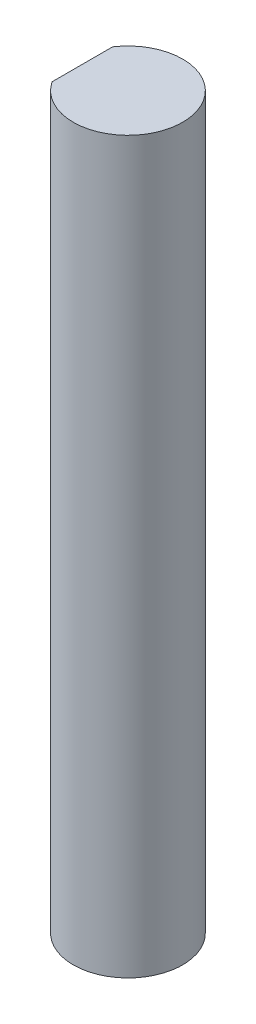
ISO-10303-21;
HEADER;
FILE_DESCRIPTION(('STEP AP214'),'2;1');
FILE_NAME('part.step','',(''),(''),'','','');
FILE_SCHEMA(('AUTOMOTIVE_DESIGN { 1 0 10303 214 1 1 1 1 }'));
ENDSEC;
DATA;
#1=APPLICATION_CONTEXT('core data for automotive mechanical design processes');
#2=APPLICATION_PROTOCOL_DEFINITION('international standard','automotive_design',2000,#1);
#3=PRODUCT_CONTEXT('',#1,'mechanical');
#4=PRODUCT('Part','Part','',(#3));
#5=PRODUCT_RELATED_PRODUCT_CATEGORY('part','',(#4));
#6=PRODUCT_DEFINITION_FORMATION('','',#4);
#7=PRODUCT_DEFINITION_CONTEXT('part definition',#1,'design');
#8=PRODUCT_DEFINITION('design','',#6,#7);
#9=PRODUCT_DEFINITION_SHAPE('','',#8);
#10=(LENGTH_UNIT() NAMED_UNIT(*) SI_UNIT(.MILLI.,.METRE.));
#11=(NAMED_UNIT(*) PLANE_ANGLE_UNIT() SI_UNIT($,.RADIAN.));
#12=(NAMED_UNIT(*) SI_UNIT($,.STERADIAN.) SOLID_ANGLE_UNIT());
#13=UNCERTAINTY_MEASURE_WITH_UNIT(LENGTH_MEASURE(1.E-05),#10,'distance_accuracy_value','');
#14=(GEOMETRIC_REPRESENTATION_CONTEXT(3) GLOBAL_UNCERTAINTY_ASSIGNED_CONTEXT((#13)) GLOBAL_UNIT_ASSIGNED_CONTEXT((#10,
#11,#12)) REPRESENTATION_CONTEXT('',''));
#15=CARTESIAN_POINT('',(0.,0.,0.));
#16=DIRECTION('',(0.,0.,1.));
#17=DIRECTION('',(1.,0.,0.));
#18=AXIS2_PLACEMENT_3D('',#15,#16,#17);
#19=CARTESIAN_POINT('',(0.,40.,0.));
#20=DIRECTION('',(0.,-1.,0.));
#21=DIRECTION('',(0.,0.,-1.));
#22=AXIS2_PLACEMENT_3D('',#19,#20,#21);
#23=CYLINDRICAL_SURFACE('',#22,3.);
#24=CARTESIAN_POINT('',(0.,0.,0.));
#25=DIRECTION('',(0.,1.,0.));
#26=DIRECTION('',(0.,0.,1.));
#27=AXIS2_PLACEMENT_3D('',#24,#25,#26);
#28=CIRCLE('',#27,3.);
#29=CARTESIAN_POINT('',(-2.5,0.,1.6583123951777));
#30=VERTEX_POINT('',#29);
#31=CARTESIAN_POINT('',(-2.5,0.,-1.6583123951777));
#32=VERTEX_POINT('',#31);
#33=EDGE_CURVE('E68',#30,#32,#28,.T.);
#34=ORIENTED_EDGE('',*,*,#33,.T.);
#35=DIRECTION('',(0.,-1.,0.));
#36=VECTOR('',#35,1.);
#37=CARTESIAN_POINT('',(-2.5,40.,-1.6583123951777));
#38=LINE('',#37,#36);
#39=CARTESIAN_POINT('',(-2.5,40.,-1.6583123951777));
#40=VERTEX_POINT('',#39);
#41=EDGE_CURVE('E11',#40,#32,#38,.T.);
#42=ORIENTED_EDGE('',*,*,#41,.F.);
#43=CARTESIAN_POINT('',(0.,40.,0.));
#44=DIRECTION('',(0.,1.,0.));
#45=DIRECTION('',(0.,0.,1.));
#46=AXIS2_PLACEMENT_3D('',#43,#44,#45);
#47=CIRCLE('',#46,3.);
#48=CARTESIAN_POINT('',(-2.5,40.,1.6583123951777));
#49=VERTEX_POINT('',#48);
#50=EDGE_CURVE('E67',#49,#40,#47,.T.);
#51=ORIENTED_EDGE('',*,*,#50,.F.);
#52=DIRECTION('',(0.,-1.,0.));
#53=VECTOR('',#52,1.);
#54=CARTESIAN_POINT('',(-2.5,40.,1.6583123951777));
#55=LINE('',#54,#53);
#56=EDGE_CURVE('E45',#49,#30,#55,.T.);
#57=ORIENTED_EDGE('',*,*,#56,.T.);
#58=EDGE_LOOP('',(#34,#42,#51,#57));
#59=FACE_BOUND('',#58,.T.);
#60=ADVANCED_FACE('F37',(#59),#23,.T.);
#61=CARTESIAN_POINT('',(-2.5,40.,-1.6583123951777));
#62=DIRECTION('',(1.,0.,0.));
#63=DIRECTION('',(0.,0.,-1.));
#64=AXIS2_PLACEMENT_3D('',#61,#62,#63);
#65=PLANE('',#64);
#66=DIRECTION('',(0.,0.,1.));
#67=VECTOR('',#66,1.);
#68=CARTESIAN_POINT('',(-2.5,0.,-1.6583123951777));
#69=LINE('',#68,#67);
#70=EDGE_CURVE('E60',#32,#30,#69,.T.);
#71=ORIENTED_EDGE('',*,*,#70,.T.);
#72=ORIENTED_EDGE('',*,*,#56,.F.);
#73=DIRECTION('',(0.,0.,1.));
#74=VECTOR('',#73,1.);
#75=CARTESIAN_POINT('',(-2.5,40.,-1.6583123951777));
#76=LINE('',#75,#74);
#77=EDGE_CURVE('E52',#40,#49,#76,.T.);
#78=ORIENTED_EDGE('',*,*,#77,.F.);
#79=ORIENTED_EDGE('',*,*,#41,.T.);
#80=EDGE_LOOP('',(#71,#72,#78,#79));
#81=FACE_BOUND('',#80,.T.);
#82=ADVANCED_FACE('F63',(#81),#65,.F.);
#83=CARTESIAN_POINT('',(0.,40.,0.));
#84=DIRECTION('',(0.,1.,0.));
#85=DIRECTION('',(0.,0.,1.));
#86=AXIS2_PLACEMENT_3D('',#83,#84,#85);
#87=PLANE('',#86);
#88=ORIENTED_EDGE('',*,*,#50,.T.);
#89=ORIENTED_EDGE('',*,*,#77,.T.);
#90=EDGE_LOOP('',(#88,#89));
#91=FACE_BOUND('',#90,.T.);
#92=ADVANCED_FACE('F75',(#91),#87,.T.);
#93=CARTESIAN_POINT('',(0.,0.,0.));
#94=DIRECTION('',(0.,1.,0.));
#95=DIRECTION('',(0.,0.,1.));
#96=AXIS2_PLACEMENT_3D('',#93,#94,#95);
#97=PLANE('',#96);
#98=ORIENTED_EDGE('',*,*,#33,.F.);
#99=ORIENTED_EDGE('',*,*,#70,.F.);
#100=EDGE_LOOP('',(#98,#99));
#101=FACE_BOUND('',#100,.T.);
#102=ADVANCED_FACE('F71',(#101),#97,.F.);
#103=CLOSED_SHELL('',(#60,#82,#92,#102));
#104=MANIFOLD_SOLID_BREP('B2',#103);
#105=ADVANCED_BREP_SHAPE_REPRESENTATION('',(#18,#104),#14);
#106=SHAPE_DEFINITION_REPRESENTATION(#9,#105);
ENDSEC;
END-ISO-10303-21;
